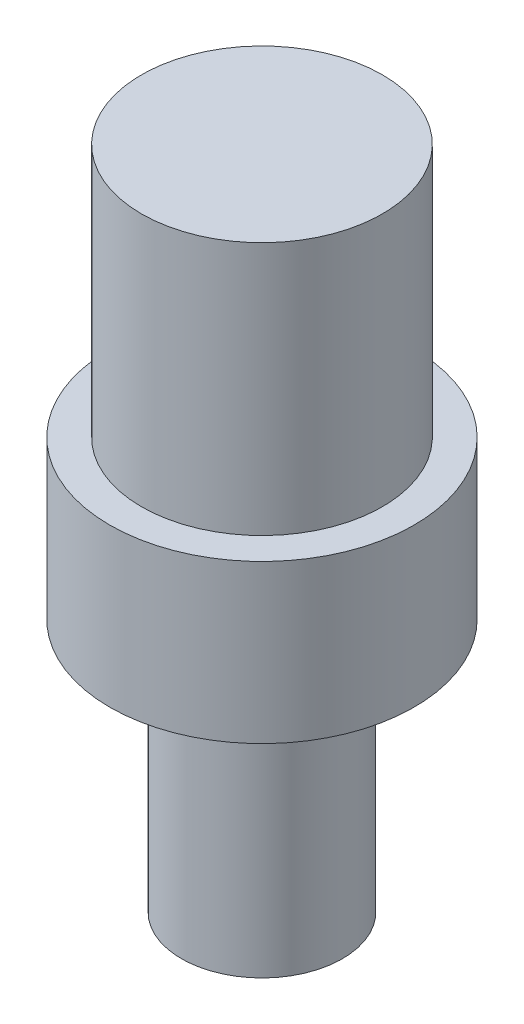
ISO-10303-21;
HEADER;
FILE_DESCRIPTION(('STEP AP214'),'2;1');
FILE_NAME('part.step','',(''),(''),'','','');
FILE_SCHEMA(('AUTOMOTIVE_DESIGN { 1 0 10303 214 1 1 1 1 }'));
ENDSEC;
DATA;
#1=APPLICATION_CONTEXT('core data for automotive mechanical design processes');
#2=APPLICATION_PROTOCOL_DEFINITION('international standard','automotive_design',2000,#1);
#3=PRODUCT_CONTEXT('',#1,'mechanical');
#4=PRODUCT('Part','Part','',(#3));
#5=PRODUCT_RELATED_PRODUCT_CATEGORY('part','',(#4));
#6=PRODUCT_DEFINITION_FORMATION('','',#4);
#7=PRODUCT_DEFINITION_CONTEXT('part definition',#1,'design');
#8=PRODUCT_DEFINITION('design','',#6,#7);
#9=PRODUCT_DEFINITION_SHAPE('','',#8);
#10=(LENGTH_UNIT() NAMED_UNIT(*) SI_UNIT(.MILLI.,.METRE.));
#11=(NAMED_UNIT(*) PLANE_ANGLE_UNIT() SI_UNIT($,.RADIAN.));
#12=(NAMED_UNIT(*) SI_UNIT($,.STERADIAN.) SOLID_ANGLE_UNIT());
#13=UNCERTAINTY_MEASURE_WITH_UNIT(LENGTH_MEASURE(1.E-05),#10,'distance_accuracy_value','');
#14=(GEOMETRIC_REPRESENTATION_CONTEXT(3) GLOBAL_UNCERTAINTY_ASSIGNED_CONTEXT((#13)) GLOBAL_UNIT_ASSIGNED_CONTEXT((#10,
#11,#12)) REPRESENTATION_CONTEXT('',''));
#15=CARTESIAN_POINT('',(0.,0.,0.));
#16=DIRECTION('',(0.,0.,1.));
#17=DIRECTION('',(1.,0.,0.));
#18=AXIS2_PLACEMENT_3D('',#15,#16,#17);
#19=CARTESIAN_POINT('',(0.,3.11,0.));
#20=DIRECTION('',(0.,-1.,0.));
#21=DIRECTION('',(0.,0.,-1.));
#22=AXIS2_PLACEMENT_3D('',#19,#20,#21);
#23=CYLINDRICAL_SURFACE('',#22,6.);
#24=CARTESIAN_POINT('',(0.,3.11,0.));
#25=DIRECTION('',(0.,1.,0.));
#26=DIRECTION('',(0.,0.,1.));
#27=AXIS2_PLACEMENT_3D('',#24,#25,#26);
#28=CIRCLE('',#27,6.);
#29=CARTESIAN_POINT('',(0.,3.11,6.));
#30=VERTEX_POINT('',#29);
#31=EDGE_CURVE('E43',#30,#30,#28,.T.);
#32=ORIENTED_EDGE('',*,*,#31,.F.);
#33=EDGE_LOOP('',(#32));
#34=FACE_BOUND('',#33,.T.);
#35=CARTESIAN_POINT('',(0.,-3.11,0.));
#36=DIRECTION('',(0.,1.,0.));
#37=DIRECTION('',(0.,0.,1.));
#38=AXIS2_PLACEMENT_3D('',#35,#36,#37);
#39=CIRCLE('',#38,6.);
#40=CARTESIAN_POINT('',(0.,-3.11,6.));
#41=VERTEX_POINT('',#40);
#42=EDGE_CURVE('E34',#41,#41,#39,.T.);
#43=ORIENTED_EDGE('',*,*,#42,.T.);
#44=EDGE_LOOP('',(#43));
#45=FACE_BOUND('',#44,.T.);
#46=ADVANCED_FACE('F31',(#34,#45),#23,.T.);
#47=CARTESIAN_POINT('',(0.,3.11,0.));
#48=DIRECTION('',(0.,1.,0.));
#49=DIRECTION('',(0.,0.,1.));
#50=AXIS2_PLACEMENT_3D('',#47,#48,#49);
#51=PLANE('',#50);
#52=CARTESIAN_POINT('',(0.,3.11,0.));
#53=DIRECTION('',(0.,1.,0.));
#54=DIRECTION('',(0.,0.,1.));
#55=AXIS2_PLACEMENT_3D('',#52,#53,#54);
#56=CIRCLE('',#55,4.75);
#57=CARTESIAN_POINT('',(0.,3.11,4.75));
#58=VERTEX_POINT('',#57);
#59=EDGE_CURVE('E38',#58,#58,#56,.T.);
#60=ORIENTED_EDGE('',*,*,#59,.F.);
#61=EDGE_LOOP('',(#60));
#62=FACE_BOUND('',#61,.T.);
#63=ORIENTED_EDGE('',*,*,#31,.T.);
#64=EDGE_LOOP('',(#63));
#65=FACE_BOUND('',#64,.T.);
#66=ADVANCED_FACE('F60',(#62,#65),#51,.T.);
#67=CARTESIAN_POINT('',(0.,-3.11,0.));
#68=DIRECTION('',(0.,1.,0.));
#69=DIRECTION('',(0.,0.,1.));
#70=AXIS2_PLACEMENT_3D('',#67,#68,#69);
#71=PLANE('',#70);
#72=CARTESIAN_POINT('',(0.,-3.11,0.));
#73=DIRECTION('',(0.,-1.,0.));
#74=DIRECTION('',(0.,0.,-1.));
#75=AXIS2_PLACEMENT_3D('',#72,#73,#74);
#76=CIRCLE('',#75,3.175);
#77=CARTESIAN_POINT('',(0.,-3.11,-3.175));
#78=VERTEX_POINT('',#77);
#79=EDGE_CURVE('E10',#78,#78,#76,.T.);
#80=ORIENTED_EDGE('',*,*,#79,.F.);
#81=EDGE_LOOP('',(#80));
#82=FACE_BOUND('',#81,.T.);
#83=ORIENTED_EDGE('',*,*,#42,.F.);
#84=EDGE_LOOP('',(#83));
#85=FACE_BOUND('',#84,.T.);
#86=ADVANCED_FACE('F57',(#82,#85),#71,.F.);
#87=CARTESIAN_POINT('',(0.,13.11,0.));
#88=DIRECTION('',(0.,-1.,0.));
#89=DIRECTION('',(0.,0.,-1.));
#90=AXIS2_PLACEMENT_3D('',#87,#88,#89);
#91=CYLINDRICAL_SURFACE('',#90,4.75);
#92=CARTESIAN_POINT('',(0.,13.11,0.));
#93=DIRECTION('',(0.,1.,0.));
#94=DIRECTION('',(0.,0.,1.));
#95=AXIS2_PLACEMENT_3D('',#92,#93,#94);
#96=CIRCLE('',#95,4.75);
#97=CARTESIAN_POINT('',(0.,13.11,4.75));
#98=VERTEX_POINT('',#97);
#99=EDGE_CURVE('E48',#98,#98,#96,.T.);
#100=ORIENTED_EDGE('',*,*,#99,.F.);
#101=EDGE_LOOP('',(#100));
#102=FACE_BOUND('',#101,.T.);
#103=ORIENTED_EDGE('',*,*,#59,.T.);
#104=EDGE_LOOP('',(#103));
#105=FACE_BOUND('',#104,.T.);
#106=ADVANCED_FACE('F59',(#102,#105),#91,.T.);
#107=CARTESIAN_POINT('',(0.,13.11,0.));
#108=DIRECTION('',(0.,1.,0.));
#109=DIRECTION('',(0.,0.,1.));
#110=AXIS2_PLACEMENT_3D('',#107,#108,#109);
#111=PLANE('',#110);
#112=ORIENTED_EDGE('',*,*,#99,.T.);
#113=EDGE_LOOP('',(#112));
#114=FACE_BOUND('',#113,.T.);
#115=ADVANCED_FACE('F66',(#114),#111,.T.);
#116=CARTESIAN_POINT('',(0.,-13.11,0.));
#117=DIRECTION('',(0.,1.,0.));
#118=DIRECTION('',(0.,0.,1.));
#119=AXIS2_PLACEMENT_3D('',#116,#117,#118);
#120=CYLINDRICAL_SURFACE('',#119,3.175);
#121=CARTESIAN_POINT('',(0.,-13.11,0.));
#122=DIRECTION('',(0.,-1.,0.));
#123=DIRECTION('',(0.,0.,-1.));
#124=AXIS2_PLACEMENT_3D('',#121,#122,#123);
#125=CIRCLE('',#124,3.175);
#126=CARTESIAN_POINT('',(0.,-13.11,-3.175));
#127=VERTEX_POINT('',#126);
#128=EDGE_CURVE('E47',#127,#127,#125,.T.);
#129=ORIENTED_EDGE('',*,*,#128,.F.);
#130=EDGE_LOOP('',(#129));
#131=FACE_BOUND('',#130,.T.);
#132=ORIENTED_EDGE('',*,*,#79,.T.);
#133=EDGE_LOOP('',(#132));
#134=FACE_BOUND('',#133,.T.);
#135=ADVANCED_FACE('F94',(#131,#134),#120,.T.);
#136=CARTESIAN_POINT('',(0.,-13.11,0.));
#137=DIRECTION('',(0.,-1.,0.));
#138=DIRECTION('',(0.,0.,-1.));
#139=AXIS2_PLACEMENT_3D('',#136,#137,#138);
#140=PLANE('',#139);
#141=ORIENTED_EDGE('',*,*,#128,.T.);
#142=EDGE_LOOP('',(#141));
#143=FACE_BOUND('',#142,.T.);
#144=ADVANCED_FACE('F108',(#143),#140,.T.);
#145=CLOSED_SHELL('',(#46,#66,#86,#106,#115,#135,#144));
#146=MANIFOLD_SOLID_BREP('B2',#145);
#147=ADVANCED_BREP_SHAPE_REPRESENTATION('',(#18,#146),#14);
#148=SHAPE_DEFINITION_REPRESENTATION(#9,#147);
ENDSEC;
END-ISO-10303-21;
